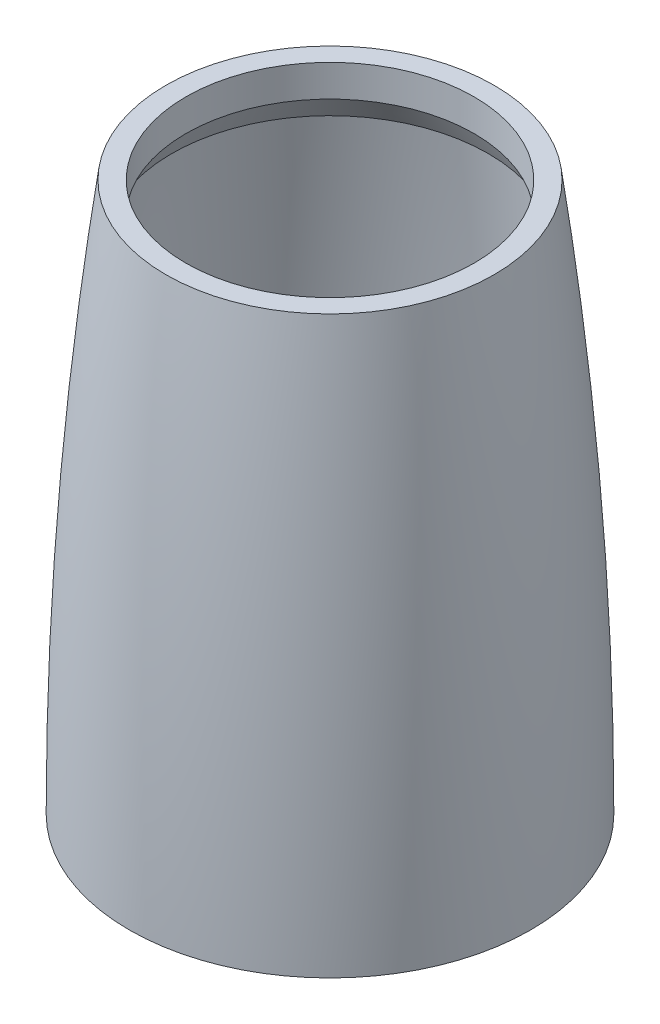
ISO-10303-21;
HEADER;
FILE_DESCRIPTION(('STEP AP214'),'2;1');
FILE_NAME('part.step','',(''),(''),'','','');
FILE_SCHEMA(('AUTOMOTIVE_DESIGN { 1 0 10303 214 1 1 1 1 }'));
ENDSEC;
DATA;
#1=APPLICATION_CONTEXT('core data for automotive mechanical design processes');
#2=APPLICATION_PROTOCOL_DEFINITION('international standard','automotive_design',2000,#1);
#3=PRODUCT_CONTEXT('',#1,'mechanical');
#4=PRODUCT('Part','Part','',(#3));
#5=PRODUCT_RELATED_PRODUCT_CATEGORY('part','',(#4));
#6=PRODUCT_DEFINITION_FORMATION('','',#4);
#7=PRODUCT_DEFINITION_CONTEXT('part definition',#1,'design');
#8=PRODUCT_DEFINITION('design','',#6,#7);
#9=PRODUCT_DEFINITION_SHAPE('','',#8);
#10=(LENGTH_UNIT() NAMED_UNIT(*) SI_UNIT(.MILLI.,.METRE.));
#11=(NAMED_UNIT(*) PLANE_ANGLE_UNIT() SI_UNIT($,.RADIAN.));
#12=(NAMED_UNIT(*) SI_UNIT($,.STERADIAN.) SOLID_ANGLE_UNIT());
#13=UNCERTAINTY_MEASURE_WITH_UNIT(LENGTH_MEASURE(1.E-05),#10,'distance_accuracy_value','');
#14=(GEOMETRIC_REPRESENTATION_CONTEXT(3) GLOBAL_UNCERTAINTY_ASSIGNED_CONTEXT((#13)) GLOBAL_UNIT_ASSIGNED_CONTEXT((#10,
#11,#12)) REPRESENTATION_CONTEXT('',''));
#15=CARTESIAN_POINT('',(0.,0.,0.));
#16=DIRECTION('',(0.,0.,1.));
#17=DIRECTION('',(1.,0.,0.));
#18=AXIS2_PLACEMENT_3D('',#15,#16,#17);
#19=CARTESIAN_POINT('',(0.,0.,0.));
#20=DIRECTION('',(0.,-1.,0.));
#21=DIRECTION('',(0.,0.,-1.));
#22=AXIS2_PLACEMENT_3D('',#19,#20,#21);
#23=DEGENERATE_TOROIDAL_SURFACE('',#22,1001.60919402984,1052.66319402984,.F.);
#24=CARTESIAN_POINT('',(0.,0.,0.));
#25=DIRECTION('',(0.,-1.,0.));
#26=DIRECTION('',(0.,0.,-1.));
#27=AXIS2_PLACEMENT_3D('',#24,#25,#26);
#28=CIRCLE('',#27,51.054);
#29=CARTESIAN_POINT('',(0.,0.,-51.054));
#30=VERTEX_POINT('',#29);
#31=EDGE_CURVE('E62',#30,#30,#28,.T.);
#32=ORIENTED_EDGE('',*,*,#31,.F.);
#33=EDGE_LOOP('',(#32));
#34=FACE_BOUND('',#33,.T.);
#35=CARTESIAN_POINT('',(0.,139.7,0.));
#36=DIRECTION('',(0.,-1.,0.));
#37=DIRECTION('',(0.,0.,-1.));
#38=AXIS2_PLACEMENT_3D('',#35,#36,#37);
#39=CIRCLE('',#38,41.7429565238956);
#40=CARTESIAN_POINT('',(0.,139.7,-41.7429565238956));
#41=VERTEX_POINT('',#40);
#42=EDGE_CURVE('E10',#41,#41,#39,.T.);
#43=ORIENTED_EDGE('',*,*,#42,.T.);
#44=EDGE_LOOP('',(#43));
#45=FACE_BOUND('',#44,.T.);
#46=ADVANCED_FACE('F34',(#34,#45),#23,.F.);
#47=CARTESIAN_POINT('',(0.,139.7,41.7429565238956));
#48=DIRECTION('',(0.,-1.,0.));
#49=DIRECTION('',(0.,0.,-1.));
#50=AXIS2_PLACEMENT_3D('',#47,#48,#49);
#51=PLANE('',#50);
#52=ORIENTED_EDGE('',*,*,#42,.F.);
#53=EDGE_LOOP('',(#52));
#54=FACE_BOUND('',#53,.T.);
#55=CARTESIAN_POINT('',(0.,139.7,0.));
#56=DIRECTION('',(0.,-1.,0.));
#57=DIRECTION('',(0.,0.,-1.));
#58=AXIS2_PLACEMENT_3D('',#55,#56,#57);
#59=CIRCLE('',#58,36.6629565238956);
#60=CARTESIAN_POINT('',(0.,139.7,-36.6629565238956));
#61=VERTEX_POINT('',#60);
#62=EDGE_CURVE('E40',#61,#61,#59,.T.);
#63=ORIENTED_EDGE('',*,*,#62,.T.);
#64=EDGE_LOOP('',(#63));
#65=FACE_BOUND('',#64,.T.);
#66=ADVANCED_FACE('F69',(#54,#65),#51,.F.);
#67=CARTESIAN_POINT('',(0.,0.,0.));
#68=DIRECTION('',(0.,-1.,0.));
#69=DIRECTION('',(0.,0.,-1.));
#70=AXIS2_PLACEMENT_3D('',#67,#68,#69);
#71=CYLINDRICAL_SURFACE('',#70,36.6629565238956);
#72=ORIENTED_EDGE('',*,*,#62,.F.);
#73=EDGE_LOOP('',(#72));
#74=FACE_BOUND('',#73,.T.);
#75=CARTESIAN_POINT('',(0.,131.601387737431,0.));
#76=DIRECTION('',(0.,-1.,0.));
#77=DIRECTION('',(0.,0.,-1.));
#78=AXIS2_PLACEMENT_3D('',#75,#76,#77);
#79=CIRCLE('',#78,36.6629565238956);
#80=CARTESIAN_POINT('',(0.,131.601387737431,-36.6629565238956));
#81=VERTEX_POINT('',#80);
#82=EDGE_CURVE('E44',#81,#81,#79,.T.);
#83=ORIENTED_EDGE('',*,*,#82,.T.);
#84=EDGE_LOOP('',(#83));
#85=FACE_BOUND('',#84,.T.);
#86=ADVANCED_FACE('F73',(#74,#85),#71,.F.);
#87=CARTESIAN_POINT('',(0.,125.424075987479,0.));
#88=DIRECTION('',(0.,-1.,0.));
#89=DIRECTION('',(0.,0.,-1.));
#90=AXIS2_PLACEMENT_3D('',#87,#88,#89);
#91=CONICAL_SURFACE('',#90,40.229429125598,0.52359877559824);
#92=ORIENTED_EDGE('',*,*,#82,.F.);
#93=EDGE_LOOP('',(#92));
#94=FACE_BOUND('',#93,.T.);
#95=CARTESIAN_POINT('',(0.,125.424075987479,0.));
#96=DIRECTION('',(0.,-1.,0.));
#97=DIRECTION('',(0.,0.,-1.));
#98=AXIS2_PLACEMENT_3D('',#95,#96,#97);
#99=CIRCLE('',#98,40.229429125598);
#100=CARTESIAN_POINT('',(0.,125.424075987479,-40.229429125598));
#101=VERTEX_POINT('',#100);
#102=EDGE_CURVE('E48',#101,#101,#99,.T.);
#103=ORIENTED_EDGE('',*,*,#102,.T.);
#104=EDGE_LOOP('',(#103));
#105=FACE_BOUND('',#104,.T.);
#106=ADVANCED_FACE('F78',(#94,#105),#91,.F.);
#107=CARTESIAN_POINT('',(0.,0.,0.));
#108=DIRECTION('',(0.,-1.,0.));
#109=DIRECTION('',(0.,0.,-1.));
#110=AXIS2_PLACEMENT_3D('',#107,#108,#109);
#111=DEGENERATE_TOROIDAL_SURFACE('',#110,1001.60919402984,1049.36119402984,.F.);
#112=ORIENTED_EDGE('',*,*,#102,.F.);
#113=EDGE_LOOP('',(#112));
#114=FACE_BOUND('',#113,.T.);
#115=CARTESIAN_POINT('',(0.,11.080258100681,0.));
#116=DIRECTION('',(0.,-1.,0.));
#117=DIRECTION('',(0.,0.,-1.));
#118=AXIS2_PLACEMENT_3D('',#115,#116,#117);
#119=CIRCLE('',#118,47.693499865565);
#120=CARTESIAN_POINT('',(0.,11.080258100681,-47.693499865565));
#121=VERTEX_POINT('',#120);
#122=EDGE_CURVE('E53',#121,#121,#119,.T.);
#123=ORIENTED_EDGE('',*,*,#122,.T.);
#124=EDGE_LOOP('',(#123));
#125=FACE_BOUND('',#124,.T.);
#126=ADVANCED_FACE('F84',(#114,#125),#111,.T.);
#127=CARTESIAN_POINT('',(0.,10.16,0.));
#128=DIRECTION('',(0.,1.,0.));
#129=DIRECTION('',(0.,0.,1.));
#130=AXIS2_PLACEMENT_3D('',#127,#128,#129);
#131=CONICAL_SURFACE('',#130,45.72,1.13446401379624);
#132=ORIENTED_EDGE('',*,*,#122,.F.);
#133=EDGE_LOOP('',(#132));
#134=FACE_BOUND('',#133,.T.);
#135=CARTESIAN_POINT('',(0.,10.16,0.));
#136=DIRECTION('',(0.,-1.,0.));
#137=DIRECTION('',(0.,0.,-1.));
#138=AXIS2_PLACEMENT_3D('',#135,#136,#137);
#139=CIRCLE('',#138,45.72);
#140=CARTESIAN_POINT('',(0.,10.16,-45.72));
#141=VERTEX_POINT('',#140);
#142=EDGE_CURVE('E56',#141,#141,#139,.T.);
#143=ORIENTED_EDGE('',*,*,#142,.T.);
#144=EDGE_LOOP('',(#143));
#145=FACE_BOUND('',#144,.T.);
#146=ADVANCED_FACE('F88',(#134,#145),#131,.F.);
#147=CARTESIAN_POINT('',(0.,0.,0.));
#148=DIRECTION('',(0.,-1.,0.));
#149=DIRECTION('',(0.,0.,-1.));
#150=AXIS2_PLACEMENT_3D('',#147,#148,#149);
#151=CYLINDRICAL_SURFACE('',#150,45.72);
#152=ORIENTED_EDGE('',*,*,#142,.F.);
#153=EDGE_LOOP('',(#152));
#154=FACE_BOUND('',#153,.T.);
#155=CARTESIAN_POINT('',(0.,0.,0.));
#156=DIRECTION('',(0.,-1.,0.));
#157=DIRECTION('',(0.,0.,-1.));
#158=AXIS2_PLACEMENT_3D('',#155,#156,#157);
#159=CIRCLE('',#158,45.72);
#160=CARTESIAN_POINT('',(0.,0.,-45.72));
#161=VERTEX_POINT('',#160);
#162=EDGE_CURVE('E59',#161,#161,#159,.T.);
#163=ORIENTED_EDGE('',*,*,#162,.T.);
#164=EDGE_LOOP('',(#163));
#165=FACE_BOUND('',#164,.T.);
#166=ADVANCED_FACE('F92',(#154,#165),#151,.F.);
#167=CARTESIAN_POINT('',(0.,0.,45.72));
#168=DIRECTION('',(0.,1.,0.));
#169=DIRECTION('',(0.,0.,1.));
#170=AXIS2_PLACEMENT_3D('',#167,#168,#169);
#171=PLANE('',#170);
#172=ORIENTED_EDGE('',*,*,#162,.F.);
#173=EDGE_LOOP('',(#172));
#174=FACE_BOUND('',#173,.T.);
#175=ORIENTED_EDGE('',*,*,#31,.T.);
#176=EDGE_LOOP('',(#175));
#177=FACE_BOUND('',#176,.T.);
#178=ADVANCED_FACE('F66',(#174,#177),#171,.F.);
#179=CLOSED_SHELL('',(#46,#66,#86,#106,#126,#146,#166,#178));
#180=MANIFOLD_SOLID_BREP('B2',#179);
#181=ADVANCED_BREP_SHAPE_REPRESENTATION('',(#18,#180),#14);
#182=SHAPE_DEFINITION_REPRESENTATION(#9,#181);
ENDSEC;
END-ISO-10303-21;
